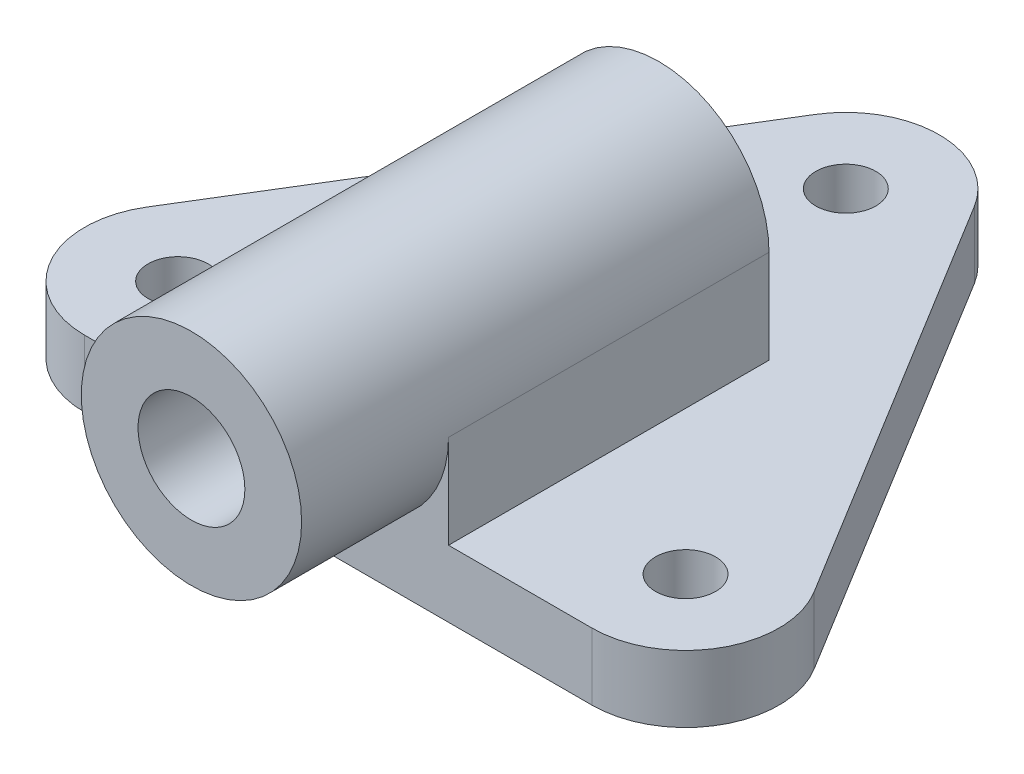
ISO-10303-21;
HEADER;
FILE_DESCRIPTION(('STEP AP214'),'2;1');
FILE_NAME('part.step','',(''),(''),'','','');
FILE_SCHEMA(('AUTOMOTIVE_DESIGN { 1 0 10303 214 1 1 1 1 }'));
ENDSEC;
DATA;
#1=APPLICATION_CONTEXT('core data for automotive mechanical design processes');
#2=APPLICATION_PROTOCOL_DEFINITION('international standard','automotive_design',2000,#1);
#3=PRODUCT_CONTEXT('',#1,'mechanical');
#4=PRODUCT('Part','Part','',(#3));
#5=PRODUCT_RELATED_PRODUCT_CATEGORY('part','',(#4));
#6=PRODUCT_DEFINITION_FORMATION('','',#4);
#7=PRODUCT_DEFINITION_CONTEXT('part definition',#1,'design');
#8=PRODUCT_DEFINITION('design','',#6,#7);
#9=PRODUCT_DEFINITION_SHAPE('','',#8);
#10=(LENGTH_UNIT() NAMED_UNIT(*) SI_UNIT(.MILLI.,.METRE.));
#11=(NAMED_UNIT(*) PLANE_ANGLE_UNIT() SI_UNIT($,.RADIAN.));
#12=(NAMED_UNIT(*) SI_UNIT($,.STERADIAN.) SOLID_ANGLE_UNIT());
#13=UNCERTAINTY_MEASURE_WITH_UNIT(LENGTH_MEASURE(1.E-05),#10,'distance_accuracy_value','');
#14=(GEOMETRIC_REPRESENTATION_CONTEXT(3) GLOBAL_UNCERTAINTY_ASSIGNED_CONTEXT((#13)) GLOBAL_UNIT_ASSIGNED_CONTEXT((#10,
#11,#12)) REPRESENTATION_CONTEXT('',''));
#15=CARTESIAN_POINT('',(0.,0.,0.));
#16=DIRECTION('',(0.,0.,1.));
#17=DIRECTION('',(1.,0.,0.));
#18=AXIS2_PLACEMENT_3D('',#15,#16,#17);
#19=CARTESIAN_POINT('',(0.,10.,-62.));
#20=DIRECTION('',(0.,1.,0.));
#21=DIRECTION('',(0.,0.,1.));
#22=AXIS2_PLACEMENT_3D('',#19,#20,#21);
#23=PLANE('',#22);
#24=DIRECTION('',(0.,0.,1.));
#25=VECTOR('',#24,1.);
#26=CARTESIAN_POINT('',(-16.5,10.,-34.));
#27=LINE('',#26,#25);
#28=CARTESIAN_POINT('',(-16.5,10.,-34.));
#29=VERTEX_POINT('',#28);
#30=CARTESIAN_POINT('',(-16.5,10.,14.));
#31=VERTEX_POINT('',#30);
#32=EDGE_CURVE('E146',#29,#31,#27,.T.);
#33=ORIENTED_EDGE('',*,*,#32,.F.);
#34=DIRECTION('',(1.,0.,0.));
#35=VECTOR('',#34,1.);
#36=CARTESIAN_POINT('',(0.,10.,-34.));
#37=LINE('',#36,#35);
#38=CARTESIAN_POINT('',(16.5,10.,-34.));
#39=VERTEX_POINT('',#38);
#40=EDGE_CURVE('E11',#29,#39,#37,.T.);
#41=ORIENTED_EDGE('',*,*,#40,.T.);
#42=DIRECTION('',(0.,0.,1.));
#43=VECTOR('',#42,1.);
#44=CARTESIAN_POINT('',(16.5,10.,-34.));
#45=LINE('',#44,#43);
#46=CARTESIAN_POINT('',(16.5,10.,14.));
#47=VERTEX_POINT('',#46);
#48=EDGE_CURVE('E156',#39,#47,#45,.T.);
#49=ORIENTED_EDGE('',*,*,#48,.T.);
#50=DIRECTION('',(1.,0.,0.));
#51=VECTOR('',#50,1.);
#52=CARTESIAN_POINT('',(-38.,10.,14.));
#53=LINE('',#52,#51);
#54=CARTESIAN_POINT('',(38.,10.,14.));
#55=VERTEX_POINT('',#54);
#56=EDGE_CURVE('E209',#47,#55,#53,.T.);
#57=ORIENTED_EDGE('',*,*,#56,.T.);
#58=CARTESIAN_POINT('',(38.,10.,0.));
#59=DIRECTION('',(0.,1.,0.));
#60=DIRECTION('',(0.,0.,1.));
#61=AXIS2_PLACEMENT_3D('',#58,#59,#60);
#62=CIRCLE('',#61,14.);
#63=CARTESIAN_POINT('',(49.9364175337532,10.,-7.31586881101003));
#64=VERTEX_POINT('',#63);
#65=EDGE_CURVE('E213',#55,#64,#62,.T.);
#66=ORIENTED_EDGE('',*,*,#65,.T.);
#67=DIRECTION('',(-0.522562057929288,0.,-0.852601252410943));
#68=VECTOR('',#67,1.);
#69=CARTESIAN_POINT('',(11.9364175337532,10.,-69.31586881101));
#70=LINE('',#69,#68);
#71=CARTESIAN_POINT('',(11.9364175337532,10.,-69.31586881101));
#72=VERTEX_POINT('',#71);
#73=EDGE_CURVE('E216',#64,#72,#70,.T.);
#74=ORIENTED_EDGE('',*,*,#73,.T.);
#75=CARTESIAN_POINT('',(0.,10.,-62.));
#76=DIRECTION('',(0.,1.,0.));
#77=DIRECTION('',(0.,0.,1.));
#78=AXIS2_PLACEMENT_3D('',#75,#76,#77);
#79=CIRCLE('',#78,14.);
#80=CARTESIAN_POINT('',(-11.9364175337532,10.,-69.31586881101));
#81=VERTEX_POINT('',#80);
#82=EDGE_CURVE('E198',#72,#81,#79,.T.);
#83=ORIENTED_EDGE('',*,*,#82,.T.);
#84=DIRECTION('',(-0.522562057929288,0.,0.852601252410943));
#85=VECTOR('',#84,1.);
#86=CARTESIAN_POINT('',(-11.9364175337532,10.,-69.31586881101));
#87=LINE('',#86,#85);
#88=CARTESIAN_POINT('',(-49.9364175337532,10.,-7.31586881101003));
#89=VERTEX_POINT('',#88);
#90=EDGE_CURVE('E202',#81,#89,#87,.T.);
#91=ORIENTED_EDGE('',*,*,#90,.T.);
#92=CARTESIAN_POINT('',(-38.,10.,0.));
#93=DIRECTION('',(0.,1.,0.));
#94=DIRECTION('',(0.,0.,-1.));
#95=AXIS2_PLACEMENT_3D('',#92,#93,#94);
#96=CIRCLE('',#95,14.);
#97=CARTESIAN_POINT('',(-38.,10.,14.));
#98=VERTEX_POINT('',#97);
#99=EDGE_CURVE('E206',#89,#98,#96,.T.);
#100=ORIENTED_EDGE('',*,*,#99,.T.);
#101=EDGE_CURVE('E210',#98,#31,#53,.T.);
#102=ORIENTED_EDGE('',*,*,#101,.T.);
#103=EDGE_LOOP('',(#33,#41,#49,#57,#66,#74,#83,#91,#100,#102));
#104=FACE_BOUND('',#103,.T.);
#105=CARTESIAN_POINT('',(38.,10.,0.));
#106=DIRECTION('',(0.,1.,0.));
#107=DIRECTION('',(0.,0.,1.));
#108=AXIS2_PLACEMENT_3D('',#105,#106,#107);
#109=CIRCLE('',#108,4.5);
#110=CARTESIAN_POINT('',(38.,10.,4.5));
#111=VERTEX_POINT('',#110);
#112=EDGE_CURVE('E182',#111,#111,#109,.T.);
#113=ORIENTED_EDGE('',*,*,#112,.F.);
#114=EDGE_LOOP('',(#113));
#115=FACE_BOUND('',#114,.T.);
#116=CARTESIAN_POINT('',(0.,10.,-62.));
#117=DIRECTION('',(0.,1.,0.));
#118=DIRECTION('',(0.,0.,1.));
#119=AXIS2_PLACEMENT_3D('',#116,#117,#118);
#120=CIRCLE('',#119,4.5);
#121=CARTESIAN_POINT('',(0.,10.,-57.5));
#122=VERTEX_POINT('',#121);
#123=EDGE_CURVE('E190',#122,#122,#120,.T.);
#124=ORIENTED_EDGE('',*,*,#123,.F.);
#125=EDGE_LOOP('',(#124));
#126=FACE_BOUND('',#125,.T.);
#127=CARTESIAN_POINT('',(-38.,10.,0.));
#128=DIRECTION('',(0.,1.,0.));
#129=DIRECTION('',(0.,0.,-1.));
#130=AXIS2_PLACEMENT_3D('',#127,#128,#129);
#131=CIRCLE('',#130,4.5);
#132=CARTESIAN_POINT('',(-38.,10.,-4.5));
#133=VERTEX_POINT('',#132);
#134=EDGE_CURVE('E174',#133,#133,#131,.T.);
#135=ORIENTED_EDGE('',*,*,#134,.F.);
#136=EDGE_LOOP('',(#135));
#137=FACE_BOUND('',#136,.T.);
#138=ADVANCED_FACE('F43',(#104,#115,#126,#137),#23,.T.);
#139=CARTESIAN_POINT('',(0.,24.,-34.));
#140=DIRECTION('',(0.,0.,1.));
#141=DIRECTION('',(1.,0.,0.));
#142=AXIS2_PLACEMENT_3D('',#139,#140,#141);
#143=CYLINDRICAL_SURFACE('',#142,16.5);
#144=DIRECTION('',(0.,0.,1.));
#145=VECTOR('',#144,1.);
#146=CARTESIAN_POINT('',(-16.5,24.,-34.));
#147=LINE('',#146,#145);
#148=CARTESIAN_POINT('',(-16.5,24.,-34.));
#149=VERTEX_POINT('',#148);
#150=CARTESIAN_POINT('',(-16.5,24.,14.));
#151=VERTEX_POINT('',#150);
#152=EDGE_CURVE('E144',#149,#151,#147,.T.);
#153=ORIENTED_EDGE('',*,*,#152,.T.);
#154=CARTESIAN_POINT('',(0.,24.,14.));
#155=DIRECTION('',(0.,0.,-1.));
#156=DIRECTION('',(-1.,0.,0.));
#157=AXIS2_PLACEMENT_3D('',#154,#155,#156);
#158=CIRCLE('',#157,16.5);
#159=CARTESIAN_POINT('',(16.5,24.,14.));
#160=VERTEX_POINT('',#159);
#161=EDGE_CURVE('E52',#160,#151,#158,.T.);
#162=ORIENTED_EDGE('',*,*,#161,.F.);
#163=DIRECTION('',(0.,0.,1.));
#164=VECTOR('',#163,1.);
#165=CARTESIAN_POINT('',(16.5,24.,-34.));
#166=LINE('',#165,#164);
#167=CARTESIAN_POINT('',(16.5,24.,-34.));
#168=VERTEX_POINT('',#167);
#169=EDGE_CURVE('E160',#168,#160,#166,.T.);
#170=ORIENTED_EDGE('',*,*,#169,.F.);
#171=CARTESIAN_POINT('',(0.,24.,-34.));
#172=DIRECTION('',(0.,0.,1.));
#173=DIRECTION('',(1.,0.,0.));
#174=AXIS2_PLACEMENT_3D('',#171,#172,#173);
#175=CIRCLE('',#174,16.5);
#176=EDGE_CURVE('E170',#168,#149,#175,.T.);
#177=ORIENTED_EDGE('',*,*,#176,.T.);
#178=EDGE_LOOP('',(#153,#162,#170,#177));
#179=FACE_BOUND('',#178,.T.);
#180=CARTESIAN_POINT('',(0.,24.,36.));
#181=DIRECTION('',(0.,0.,1.));
#182=DIRECTION('',(1.,0.,0.));
#183=AXIS2_PLACEMENT_3D('',#180,#181,#182);
#184=CIRCLE('',#183,16.5);
#185=CARTESIAN_POINT('',(16.5,24.,36.));
#186=VERTEX_POINT('',#185);
#187=EDGE_CURVE('E164',#186,#186,#184,.T.);
#188=ORIENTED_EDGE('',*,*,#187,.F.);
#189=EDGE_LOOP('',(#188));
#190=FACE_BOUND('',#189,.T.);
#191=ADVANCED_FACE('F298',(#179,#190),#143,.T.);
#192=CARTESIAN_POINT('',(0.,0.,-62.));
#193=DIRECTION('',(0.,1.,0.));
#194=DIRECTION('',(0.,0.,1.));
#195=AXIS2_PLACEMENT_3D('',#192,#193,#194);
#196=PLANE('',#195);
#197=CARTESIAN_POINT('',(0.,0.,-62.));
#198=DIRECTION('',(0.,1.,0.));
#199=DIRECTION('',(0.,0.,1.));
#200=AXIS2_PLACEMENT_3D('',#197,#198,#199);
#201=CIRCLE('',#200,14.);
#202=CARTESIAN_POINT('',(11.9364175337532,0.,-69.31586881101));
#203=VERTEX_POINT('',#202);
#204=CARTESIAN_POINT('',(-11.9364175337532,0.,-69.31586881101));
#205=VERTEX_POINT('',#204);
#206=EDGE_CURVE('E194',#203,#205,#201,.T.);
#207=ORIENTED_EDGE('',*,*,#206,.F.);
#208=DIRECTION('',(-0.522562057929288,0.,-0.852601252410943));
#209=VECTOR('',#208,1.);
#210=CARTESIAN_POINT('',(11.9364175337532,0.,-69.31586881101));
#211=LINE('',#210,#209);
#212=CARTESIAN_POINT('',(49.9364175337532,0.,-7.31586881101003));
#213=VERTEX_POINT('',#212);
#214=EDGE_CURVE('E203',#213,#203,#211,.T.);
#215=ORIENTED_EDGE('',*,*,#214,.F.);
#216=CARTESIAN_POINT('',(38.,0.,0.));
#217=DIRECTION('',(0.,1.,0.));
#218=DIRECTION('',(0.,0.,1.));
#219=AXIS2_PLACEMENT_3D('',#216,#217,#218);
#220=CIRCLE('',#219,14.);
#221=CARTESIAN_POINT('',(38.,0.,14.));
#222=VERTEX_POINT('',#221);
#223=EDGE_CURVE('E232',#222,#213,#220,.T.);
#224=ORIENTED_EDGE('',*,*,#223,.F.);
#225=DIRECTION('',(1.,0.,0.));
#226=VECTOR('',#225,1.);
#227=CARTESIAN_POINT('',(-38.,0.,14.));
#228=LINE('',#227,#226);
#229=CARTESIAN_POINT('',(-38.,0.,14.));
#230=VERTEX_POINT('',#229);
#231=EDGE_CURVE('E229',#230,#222,#228,.T.);
#232=ORIENTED_EDGE('',*,*,#231,.F.);
#233=CARTESIAN_POINT('',(-38.,0.,0.));
#234=DIRECTION('',(0.,1.,0.));
#235=DIRECTION('',(0.,0.,-1.));
#236=AXIS2_PLACEMENT_3D('',#233,#234,#235);
#237=CIRCLE('',#236,14.);
#238=CARTESIAN_POINT('',(-49.9364175337532,0.,-7.31586881101003));
#239=VERTEX_POINT('',#238);
#240=EDGE_CURVE('E226',#239,#230,#237,.T.);
#241=ORIENTED_EDGE('',*,*,#240,.F.);
#242=DIRECTION('',(-0.522562057929288,0.,0.852601252410943));
#243=VECTOR('',#242,1.);
#244=CARTESIAN_POINT('',(-11.9364175337532,0.,-69.31586881101));
#245=LINE('',#244,#243);
#246=EDGE_CURVE('E223',#205,#239,#245,.T.);
#247=ORIENTED_EDGE('',*,*,#246,.F.);
#248=EDGE_LOOP('',(#207,#215,#224,#232,#241,#247));
#249=FACE_BOUND('',#248,.T.);
#250=CARTESIAN_POINT('',(0.,0.,-62.));
#251=DIRECTION('',(0.,1.,0.));
#252=DIRECTION('',(0.,0.,1.));
#253=AXIS2_PLACEMENT_3D('',#250,#251,#252);
#254=CIRCLE('',#253,4.5);
#255=CARTESIAN_POINT('',(0.,0.,-57.5));
#256=VERTEX_POINT('',#255);
#257=EDGE_CURVE('E186',#256,#256,#254,.T.);
#258=ORIENTED_EDGE('',*,*,#257,.T.);
#259=EDGE_LOOP('',(#258));
#260=FACE_BOUND('',#259,.T.);
#261=CARTESIAN_POINT('',(38.,0.,0.));
#262=DIRECTION('',(0.,1.,0.));
#263=DIRECTION('',(0.,0.,1.));
#264=AXIS2_PLACEMENT_3D('',#261,#262,#263);
#265=CIRCLE('',#264,4.5);
#266=CARTESIAN_POINT('',(38.,0.,4.5));
#267=VERTEX_POINT('',#266);
#268=EDGE_CURVE('E178',#267,#267,#265,.T.);
#269=ORIENTED_EDGE('',*,*,#268,.T.);
#270=EDGE_LOOP('',(#269));
#271=FACE_BOUND('',#270,.T.);
#272=CARTESIAN_POINT('',(-38.,0.,0.));
#273=DIRECTION('',(0.,1.,0.));
#274=DIRECTION('',(0.,0.,-1.));
#275=AXIS2_PLACEMENT_3D('',#272,#273,#274);
#276=CIRCLE('',#275,4.5);
#277=CARTESIAN_POINT('',(-38.,0.,-4.5));
#278=VERTEX_POINT('',#277);
#279=EDGE_CURVE('E173',#278,#278,#276,.T.);
#280=ORIENTED_EDGE('',*,*,#279,.T.);
#281=EDGE_LOOP('',(#280));
#282=FACE_BOUND('',#281,.T.);
#283=ADVANCED_FACE('F317',(#249,#260,#271,#282),#196,.F.);
#284=CARTESIAN_POINT('',(0.,10.,-62.));
#285=DIRECTION('',(0.,-1.,0.));
#286=DIRECTION('',(0.,0.,-1.));
#287=AXIS2_PLACEMENT_3D('',#284,#285,#286);
#288=CYLINDRICAL_SURFACE('',#287,14.);
#289=ORIENTED_EDGE('',*,*,#206,.T.);
#290=DIRECTION('',(0.,-1.,0.));
#291=VECTOR('',#290,1.);
#292=CARTESIAN_POINT('',(-11.9364175337532,10.,-69.31586881101));
#293=LINE('',#292,#291);
#294=EDGE_CURVE('E256',#81,#205,#293,.T.);
#295=ORIENTED_EDGE('',*,*,#294,.F.);
#296=ORIENTED_EDGE('',*,*,#82,.F.);
#297=DIRECTION('',(0.,-1.,0.));
#298=VECTOR('',#297,1.);
#299=CARTESIAN_POINT('',(11.9364175337532,10.,-69.31586881101));
#300=LINE('',#299,#298);
#301=EDGE_CURVE('E219',#72,#203,#300,.T.);
#302=ORIENTED_EDGE('',*,*,#301,.T.);
#303=EDGE_LOOP('',(#289,#295,#296,#302));
#304=FACE_BOUND('',#303,.T.);
#305=ADVANCED_FACE('F45',(#304),#288,.T.);
#306=CARTESIAN_POINT('',(-11.9364175337532,10.,-69.31586881101));
#307=DIRECTION('',(0.852601252410943,0.,0.522562057929288));
#308=DIRECTION('',(0.522562057929288,0.,-0.852601252410943));
#309=AXIS2_PLACEMENT_3D('',#306,#307,#308);
#310=PLANE('',#309);
#311=ORIENTED_EDGE('',*,*,#246,.T.);
#312=DIRECTION('',(0.,-1.,0.));
#313=VECTOR('',#312,1.);
#314=CARTESIAN_POINT('',(-49.9364175337532,10.,-7.31586881101003));
#315=LINE('',#314,#313);
#316=EDGE_CURVE('E252',#89,#239,#315,.T.);
#317=ORIENTED_EDGE('',*,*,#316,.F.);
#318=ORIENTED_EDGE('',*,*,#90,.F.);
#319=ORIENTED_EDGE('',*,*,#294,.T.);
#320=EDGE_LOOP('',(#311,#317,#318,#319));
#321=FACE_BOUND('',#320,.T.);
#322=ADVANCED_FACE('F284',(#321),#310,.F.);
#323=CARTESIAN_POINT('',(-38.,10.,0.));
#324=DIRECTION('',(0.,-1.,0.));
#325=DIRECTION('',(0.,0.,-1.));
#326=AXIS2_PLACEMENT_3D('',#323,#324,#325);
#327=CYLINDRICAL_SURFACE('',#326,14.);
#328=ORIENTED_EDGE('',*,*,#240,.T.);
#329=DIRECTION('',(0.,-1.,0.));
#330=VECTOR('',#329,1.);
#331=CARTESIAN_POINT('',(-38.,10.,14.));
#332=LINE('',#331,#330);
#333=EDGE_CURVE('E248',#98,#230,#332,.T.);
#334=ORIENTED_EDGE('',*,*,#333,.F.);
#335=ORIENTED_EDGE('',*,*,#99,.F.);
#336=ORIENTED_EDGE('',*,*,#316,.T.);
#337=EDGE_LOOP('',(#328,#334,#335,#336));
#338=FACE_BOUND('',#337,.T.);
#339=ADVANCED_FACE('F289',(#338),#327,.T.);
#340=CARTESIAN_POINT('',(-38.,10.,14.));
#341=DIRECTION('',(0.,0.,-1.));
#342=DIRECTION('',(-1.,0.,0.));
#343=AXIS2_PLACEMENT_3D('',#340,#341,#342);
#344=PLANE('',#343);
#345=ORIENTED_EDGE('',*,*,#56,.F.);
#346=DIRECTION('',(0.,-1.,0.));
#347=VECTOR('',#346,1.);
#348=CARTESIAN_POINT('',(16.5,0.,14.));
#349=LINE('',#348,#347);
#350=EDGE_CURVE('E150',#160,#47,#349,.T.);
#351=ORIENTED_EDGE('',*,*,#350,.F.);
#352=ORIENTED_EDGE('',*,*,#161,.T.);
#353=DIRECTION('',(0.,-1.,0.));
#354=VECTOR('',#353,1.);
#355=CARTESIAN_POINT('',(-16.5,0.,14.));
#356=LINE('',#355,#354);
#357=EDGE_CURVE('E132',#151,#31,#356,.T.);
#358=ORIENTED_EDGE('',*,*,#357,.T.);
#359=ORIENTED_EDGE('',*,*,#101,.F.);
#360=ORIENTED_EDGE('',*,*,#333,.T.);
#361=ORIENTED_EDGE('',*,*,#231,.T.);
#362=DIRECTION('',(0.,-1.,0.));
#363=VECTOR('',#362,1.);
#364=CARTESIAN_POINT('',(38.,10.,14.));
#365=LINE('',#364,#363);
#366=EDGE_CURVE('E244',#55,#222,#365,.T.);
#367=ORIENTED_EDGE('',*,*,#366,.F.);
#368=EDGE_LOOP('',(#345,#351,#352,#358,#359,#360,#361,#367));
#369=FACE_BOUND('',#368,.T.);
#370=ADVANCED_FACE('F268',(#369),#344,.F.);
#371=CARTESIAN_POINT('',(38.,10.,0.));
#372=DIRECTION('',(0.,-1.,0.));
#373=DIRECTION('',(0.,0.,-1.));
#374=AXIS2_PLACEMENT_3D('',#371,#372,#373);
#375=CYLINDRICAL_SURFACE('',#374,14.);
#376=ORIENTED_EDGE('',*,*,#223,.T.);
#377=DIRECTION('',(0.,-1.,0.));
#378=VECTOR('',#377,1.);
#379=CARTESIAN_POINT('',(49.9364175337532,10.,-7.31586881101003));
#380=LINE('',#379,#378);
#381=EDGE_CURVE('E240',#64,#213,#380,.T.);
#382=ORIENTED_EDGE('',*,*,#381,.F.);
#383=ORIENTED_EDGE('',*,*,#65,.F.);
#384=ORIENTED_EDGE('',*,*,#366,.T.);
#385=EDGE_LOOP('',(#376,#382,#383,#384));
#386=FACE_BOUND('',#385,.T.);
#387=ADVANCED_FACE('F272',(#386),#375,.T.);
#388=CARTESIAN_POINT('',(11.9364175337532,10.,-69.31586881101));
#389=DIRECTION('',(-0.852601252410943,0.,0.522562057929288));
#390=DIRECTION('',(0.522562057929288,0.,0.852601252410943));
#391=AXIS2_PLACEMENT_3D('',#388,#389,#390);
#392=PLANE('',#391);
#393=ORIENTED_EDGE('',*,*,#214,.T.);
#394=ORIENTED_EDGE('',*,*,#301,.F.);
#395=ORIENTED_EDGE('',*,*,#73,.F.);
#396=ORIENTED_EDGE('',*,*,#381,.T.);
#397=EDGE_LOOP('',(#393,#394,#395,#396));
#398=FACE_BOUND('',#397,.T.);
#399=ADVANCED_FACE('F277',(#398),#392,.F.);
#400=CARTESIAN_POINT('',(0.,10.,-62.));
#401=DIRECTION('',(0.,-1.,0.));
#402=DIRECTION('',(0.,0.,-1.));
#403=AXIS2_PLACEMENT_3D('',#400,#401,#402);
#404=CYLINDRICAL_SURFACE('',#403,4.5);
#405=ORIENTED_EDGE('',*,*,#123,.T.);
#406=EDGE_LOOP('',(#405));
#407=FACE_BOUND('',#406,.T.);
#408=ORIENTED_EDGE('',*,*,#257,.F.);
#409=EDGE_LOOP('',(#408));
#410=FACE_BOUND('',#409,.T.);
#411=ADVANCED_FACE('F321',(#407,#410),#404,.F.);
#412=CARTESIAN_POINT('',(38.,10.,0.));
#413=DIRECTION('',(0.,-1.,0.));
#414=DIRECTION('',(0.,0.,-1.));
#415=AXIS2_PLACEMENT_3D('',#412,#413,#414);
#416=CYLINDRICAL_SURFACE('',#415,4.5);
#417=ORIENTED_EDGE('',*,*,#112,.T.);
#418=EDGE_LOOP('',(#417));
#419=FACE_BOUND('',#418,.T.);
#420=ORIENTED_EDGE('',*,*,#268,.F.);
#421=EDGE_LOOP('',(#420));
#422=FACE_BOUND('',#421,.T.);
#423=ADVANCED_FACE('F452',(#419,#422),#416,.F.);
#424=CARTESIAN_POINT('',(-38.,10.,0.));
#425=DIRECTION('',(0.,-1.,0.));
#426=DIRECTION('',(0.,0.,-1.));
#427=AXIS2_PLACEMENT_3D('',#424,#425,#426);
#428=CYLINDRICAL_SURFACE('',#427,4.5);
#429=ORIENTED_EDGE('',*,*,#134,.T.);
#430=EDGE_LOOP('',(#429));
#431=FACE_BOUND('',#430,.T.);
#432=ORIENTED_EDGE('',*,*,#279,.F.);
#433=EDGE_LOOP('',(#432));
#434=FACE_BOUND('',#433,.T.);
#435=ADVANCED_FACE('F367',(#431,#434),#428,.F.);
#436=CARTESIAN_POINT('',(0.,0.,-34.));
#437=DIRECTION('',(0.,0.,1.));
#438=DIRECTION('',(1.,0.,0.));
#439=AXIS2_PLACEMENT_3D('',#436,#437,#438);
#440=PLANE('',#439);
#441=ORIENTED_EDGE('',*,*,#40,.F.);
#442=DIRECTION('',(0.,-1.,0.));
#443=VECTOR('',#442,1.);
#444=CARTESIAN_POINT('',(-16.5,0.,-34.));
#445=LINE('',#444,#443);
#446=EDGE_CURVE('E137',#149,#29,#445,.T.);
#447=ORIENTED_EDGE('',*,*,#446,.F.);
#448=ORIENTED_EDGE('',*,*,#176,.F.);
#449=DIRECTION('',(0.,-1.,0.));
#450=VECTOR('',#449,1.);
#451=CARTESIAN_POINT('',(16.5,0.,-34.));
#452=LINE('',#451,#450);
#453=EDGE_CURVE('E153',#168,#39,#452,.T.);
#454=ORIENTED_EDGE('',*,*,#453,.T.);
#455=EDGE_LOOP('',(#441,#447,#448,#454));
#456=FACE_BOUND('',#455,.T.);
#457=ADVANCED_FACE('F294',(#456),#440,.F.);
#458=CARTESIAN_POINT('',(0.,0.,36.));
#459=DIRECTION('',(0.,0.,1.));
#460=DIRECTION('',(1.,0.,0.));
#461=AXIS2_PLACEMENT_3D('',#458,#459,#460);
#462=PLANE('',#461);
#463=CARTESIAN_POINT('',(0.,24.,36.));
#464=DIRECTION('',(0.,0.,1.));
#465=DIRECTION('',(1.,0.,0.));
#466=AXIS2_PLACEMENT_3D('',#463,#464,#465);
#467=CIRCLE('',#466,7.99999999999999);
#468=CARTESIAN_POINT('',(7.99999999999999,24.,36.));
#469=VERTEX_POINT('',#468);
#470=EDGE_CURVE('E133',#469,#469,#467,.T.);
#471=ORIENTED_EDGE('',*,*,#470,.F.);
#472=EDGE_LOOP('',(#471));
#473=FACE_BOUND('',#472,.T.);
#474=ORIENTED_EDGE('',*,*,#187,.T.);
#475=EDGE_LOOP('',(#474));
#476=FACE_BOUND('',#475,.T.);
#477=ADVANCED_FACE('F303',(#473,#476),#462,.T.);
#478=CARTESIAN_POINT('',(16.5,0.,-34.));
#479=DIRECTION('',(-1.,0.,0.));
#480=DIRECTION('',(0.,0.,1.));
#481=AXIS2_PLACEMENT_3D('',#478,#479,#480);
#482=PLANE('',#481);
#483=ORIENTED_EDGE('',*,*,#350,.T.);
#484=ORIENTED_EDGE('',*,*,#48,.F.);
#485=ORIENTED_EDGE('',*,*,#453,.F.);
#486=ORIENTED_EDGE('',*,*,#169,.T.);
#487=EDGE_LOOP('',(#483,#484,#485,#486));
#488=FACE_BOUND('',#487,.T.);
#489=ADVANCED_FACE('F301',(#488),#482,.F.);
#490=CARTESIAN_POINT('',(-16.5,0.,-34.));
#491=DIRECTION('',(-1.,0.,0.));
#492=DIRECTION('',(0.,0.,1.));
#493=AXIS2_PLACEMENT_3D('',#490,#491,#492);
#494=PLANE('',#493);
#495=ORIENTED_EDGE('',*,*,#357,.F.);
#496=ORIENTED_EDGE('',*,*,#152,.F.);
#497=ORIENTED_EDGE('',*,*,#446,.T.);
#498=ORIENTED_EDGE('',*,*,#32,.T.);
#499=EDGE_LOOP('',(#495,#496,#497,#498));
#500=FACE_BOUND('',#499,.T.);
#501=ADVANCED_FACE('F125',(#500),#494,.T.);
#502=CARTESIAN_POINT('',(0.,24.,-18.));
#503=DIRECTION('',(0.,0.,1.));
#504=DIRECTION('',(1.,0.,0.));
#505=AXIS2_PLACEMENT_3D('',#502,#503,#504);
#506=CONICAL_SURFACE('',#505,7.99999999999999,1.02974425867665);
#507=CARTESIAN_POINT('',(0.,24.,-22.8068849522205));
#508=VERTEX_POINT('',#507);
#509=VERTEX_LOOP('',#508);
#510=FACE_BOUND('',#509,.T.);
#511=CARTESIAN_POINT('',(0.,24.,-18.));
#512=DIRECTION('',(0.,0.,1.));
#513=DIRECTION('',(1.,0.,0.));
#514=AXIS2_PLACEMENT_3D('',#511,#512,#513);
#515=CIRCLE('',#514,7.99999999999999);
#516=CARTESIAN_POINT('',(7.99999999999999,24.,-18.));
#517=VERTEX_POINT('',#516);
#518=EDGE_CURVE('E129',#517,#517,#515,.T.);
#519=ORIENTED_EDGE('',*,*,#518,.T.);
#520=EDGE_LOOP('',(#519));
#521=FACE_BOUND('',#520,.T.);
#522=ADVANCED_FACE('F121',(#510,#521),#506,.F.);
#523=CARTESIAN_POINT('',(0.,24.,36.));
#524=DIRECTION('',(0.,0.,1.));
#525=DIRECTION('',(1.,0.,0.));
#526=AXIS2_PLACEMENT_3D('',#523,#524,#525);
#527=CYLINDRICAL_SURFACE('',#526,7.99999999999999);
#528=ORIENTED_EDGE('',*,*,#518,.F.);
#529=EDGE_LOOP('',(#528));
#530=FACE_BOUND('',#529,.T.);
#531=ORIENTED_EDGE('',*,*,#470,.T.);
#532=EDGE_LOOP('',(#531));
#533=FACE_BOUND('',#532,.T.);
#534=ADVANCED_FACE('F124',(#530,#533),#527,.F.);
#535=CLOSED_SHELL('',(#138,#191,#283,#305,#322,#339,#370,#387,#399,#411,#423,#435,#457,#477,
#489,#501,#522,#534));
#536=MANIFOLD_SOLID_BREP('B2',#535);
#537=ADVANCED_BREP_SHAPE_REPRESENTATION('',(#18,#536),#14);
#538=SHAPE_DEFINITION_REPRESENTATION(#9,#537);
ENDSEC;
END-ISO-10303-21;
